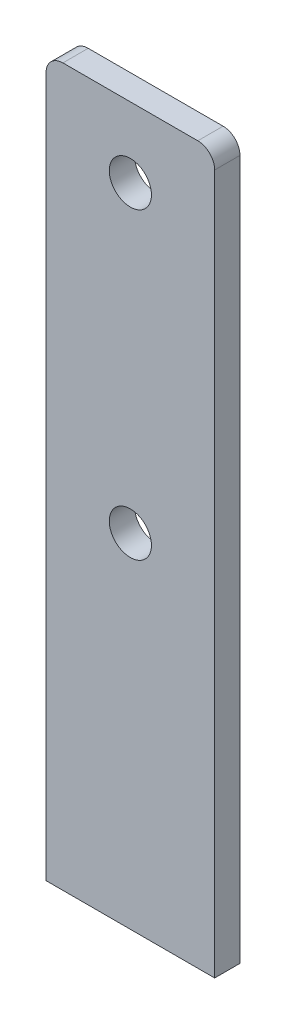
ISO-10303-21;
HEADER;
FILE_DESCRIPTION(('STEP AP214'),'2;1');
FILE_NAME('part.step','',(''),(''),'','','');
FILE_SCHEMA(('AUTOMOTIVE_DESIGN { 1 0 10303 214 1 1 1 1 }'));
ENDSEC;
DATA;
#1=APPLICATION_CONTEXT('core data for automotive mechanical design processes');
#2=APPLICATION_PROTOCOL_DEFINITION('international standard','automotive_design',2000,#1);
#3=PRODUCT_CONTEXT('',#1,'mechanical');
#4=PRODUCT('Part','Part','',(#3));
#5=PRODUCT_RELATED_PRODUCT_CATEGORY('part','',(#4));
#6=PRODUCT_DEFINITION_FORMATION('','',#4);
#7=PRODUCT_DEFINITION_CONTEXT('part definition',#1,'design');
#8=PRODUCT_DEFINITION('design','',#6,#7);
#9=PRODUCT_DEFINITION_SHAPE('','',#8);
#10=(LENGTH_UNIT() NAMED_UNIT(*) SI_UNIT(.MILLI.,.METRE.));
#11=(NAMED_UNIT(*) PLANE_ANGLE_UNIT() SI_UNIT($,.RADIAN.));
#12=(NAMED_UNIT(*) SI_UNIT($,.STERADIAN.) SOLID_ANGLE_UNIT());
#13=UNCERTAINTY_MEASURE_WITH_UNIT(LENGTH_MEASURE(1.E-05),#10,'distance_accuracy_value','');
#14=(GEOMETRIC_REPRESENTATION_CONTEXT(3) GLOBAL_UNCERTAINTY_ASSIGNED_CONTEXT((#13)) GLOBAL_UNIT_ASSIGNED_CONTEXT((#10,
#11,#12)) REPRESENTATION_CONTEXT('',''));
#15=CARTESIAN_POINT('',(0.,0.,0.));
#16=DIRECTION('',(0.,0.,1.));
#17=DIRECTION('',(1.,0.,0.));
#18=AXIS2_PLACEMENT_3D('',#15,#16,#17);
#19=CARTESIAN_POINT('',(0.,85.,3.));
#20=DIRECTION('',(0.,-1.,0.));
#21=DIRECTION('',(0.,0.,-1.));
#22=AXIS2_PLACEMENT_3D('',#19,#20,#21);
#23=PLANE('',#22);
#24=DIRECTION('',(-1.,0.,0.));
#25=VECTOR('',#24,1.);
#26=CARTESIAN_POINT('',(0.,85.,0.));
#27=LINE('',#26,#25);
#28=CARTESIAN_POINT('',(18.,85.,0.));
#29=VERTEX_POINT('',#28);
#30=CARTESIAN_POINT('',(2.,85.,0.));
#31=VERTEX_POINT('',#30);
#32=EDGE_CURVE('E141',#29,#31,#27,.T.);
#33=ORIENTED_EDGE('',*,*,#32,.T.);
#34=DIRECTION('',(0.,0.,-1.));
#35=VECTOR('',#34,1.);
#36=CARTESIAN_POINT('',(2.,85.,3.));
#37=LINE('',#36,#35);
#38=CARTESIAN_POINT('',(2.,85.,3.));
#39=VERTEX_POINT('',#38);
#40=EDGE_CURVE('E11',#39,#31,#37,.T.);
#41=ORIENTED_EDGE('',*,*,#40,.F.);
#42=DIRECTION('',(-1.,0.,0.));
#43=VECTOR('',#42,1.);
#44=CARTESIAN_POINT('',(0.,85.,3.));
#45=LINE('',#44,#43);
#46=CARTESIAN_POINT('',(18.,85.,3.));
#47=VERTEX_POINT('',#46);
#48=EDGE_CURVE('E275',#47,#39,#45,.T.);
#49=ORIENTED_EDGE('',*,*,#48,.F.);
#50=DIRECTION('',(0.,0.,-1.));
#51=VECTOR('',#50,1.);
#52=CARTESIAN_POINT('',(18.,85.,3.));
#53=LINE('',#52,#51);
#54=EDGE_CURVE('E59',#47,#29,#53,.T.);
#55=ORIENTED_EDGE('',*,*,#54,.T.);
#56=EDGE_LOOP('',(#33,#41,#49,#55));
#57=FACE_BOUND('',#56,.T.);
#58=ADVANCED_FACE('F41',(#57),#23,.F.);
#59=CARTESIAN_POINT('',(2.,83.,3.));
#60=DIRECTION('',(0.,0.,-1.));
#61=DIRECTION('',(-1.,0.,0.));
#62=AXIS2_PLACEMENT_3D('',#59,#60,#61);
#63=CYLINDRICAL_SURFACE('',#62,1.99999999999999);
#64=CARTESIAN_POINT('',(2.,83.,0.));
#65=DIRECTION('',(0.,0.,1.));
#66=DIRECTION('',(1.,0.,0.));
#67=AXIS2_PLACEMENT_3D('',#64,#65,#66);
#68=CIRCLE('',#67,1.99999999999999);
#69=CARTESIAN_POINT('',(0.,83.,0.));
#70=VERTEX_POINT('',#69);
#71=EDGE_CURVE('E144',#31,#70,#68,.T.);
#72=ORIENTED_EDGE('',*,*,#71,.T.);
#73=DIRECTION('',(0.,0.,-1.));
#74=VECTOR('',#73,1.);
#75=CARTESIAN_POINT('',(0.,83.,3.));
#76=LINE('',#75,#74);
#77=CARTESIAN_POINT('',(0.,83.,3.));
#78=VERTEX_POINT('',#77);
#79=EDGE_CURVE('E51',#78,#70,#76,.T.);
#80=ORIENTED_EDGE('',*,*,#79,.F.);
#81=CARTESIAN_POINT('',(2.,83.,3.));
#82=DIRECTION('',(0.,0.,1.));
#83=DIRECTION('',(1.,0.,0.));
#84=AXIS2_PLACEMENT_3D('',#81,#82,#83);
#85=CIRCLE('',#84,1.99999999999999);
#86=EDGE_CURVE('E92',#39,#78,#85,.T.);
#87=ORIENTED_EDGE('',*,*,#86,.F.);
#88=ORIENTED_EDGE('',*,*,#40,.T.);
#89=EDGE_LOOP('',(#72,#80,#87,#88));
#90=FACE_BOUND('',#89,.T.);
#91=ADVANCED_FACE('F171',(#90),#63,.T.);
#92=CARTESIAN_POINT('',(0.,0.,3.));
#93=DIRECTION('',(-1.,0.,0.));
#94=DIRECTION('',(0.,0.,1.));
#95=AXIS2_PLACEMENT_3D('',#92,#93,#94);
#96=PLANE('',#95);
#97=DIRECTION('',(0.,1.,0.));
#98=VECTOR('',#97,1.);
#99=CARTESIAN_POINT('',(0.,0.,0.));
#100=LINE('',#99,#98);
#101=CARTESIAN_POINT('',(0.,0.,0.));
#102=VERTEX_POINT('',#101);
#103=EDGE_CURVE('E148',#102,#70,#100,.T.);
#104=ORIENTED_EDGE('',*,*,#103,.F.);
#105=DIRECTION('',(0.,0.,-1.));
#106=VECTOR('',#105,1.);
#107=CARTESIAN_POINT('',(0.,0.,3.));
#108=LINE('',#107,#106);
#109=CARTESIAN_POINT('',(0.,0.,3.));
#110=VERTEX_POINT('',#109);
#111=EDGE_CURVE('E112',#110,#102,#108,.T.);
#112=ORIENTED_EDGE('',*,*,#111,.F.);
#113=DIRECTION('',(0.,1.,0.));
#114=VECTOR('',#113,1.);
#115=CARTESIAN_POINT('',(0.,0.,3.));
#116=LINE('',#115,#114);
#117=EDGE_CURVE('E124',#110,#78,#116,.T.);
#118=ORIENTED_EDGE('',*,*,#117,.T.);
#119=ORIENTED_EDGE('',*,*,#79,.T.);
#120=EDGE_LOOP('',(#104,#112,#118,#119));
#121=FACE_BOUND('',#120,.T.);
#122=ADVANCED_FACE('F170',(#121),#96,.T.);
#123=CARTESIAN_POINT('',(0.,0.,3.));
#124=DIRECTION('',(0.,-1.,0.));
#125=DIRECTION('',(0.,0.,-1.));
#126=AXIS2_PLACEMENT_3D('',#123,#124,#125);
#127=PLANE('',#126);
#128=DIRECTION('',(-1.,0.,0.));
#129=VECTOR('',#128,1.);
#130=CARTESIAN_POINT('',(0.,0.,0.));
#131=LINE('',#130,#129);
#132=CARTESIAN_POINT('',(20.,0.,0.));
#133=VERTEX_POINT('',#132);
#134=EDGE_CURVE('E108',#133,#102,#131,.T.);
#135=ORIENTED_EDGE('',*,*,#134,.F.);
#136=DIRECTION('',(0.,0.,-1.));
#137=VECTOR('',#136,1.);
#138=CARTESIAN_POINT('',(20.,0.,3.));
#139=LINE('',#138,#137);
#140=CARTESIAN_POINT('',(20.,0.,3.));
#141=VERTEX_POINT('',#140);
#142=EDGE_CURVE('E102',#141,#133,#139,.T.);
#143=ORIENTED_EDGE('',*,*,#142,.F.);
#144=DIRECTION('',(-1.,0.,0.));
#145=VECTOR('',#144,1.);
#146=CARTESIAN_POINT('',(0.,0.,3.));
#147=LINE('',#146,#145);
#148=EDGE_CURVE('E106',#141,#110,#147,.T.);
#149=ORIENTED_EDGE('',*,*,#148,.T.);
#150=ORIENTED_EDGE('',*,*,#111,.T.);
#151=EDGE_LOOP('',(#135,#143,#149,#150));
#152=FACE_BOUND('',#151,.T.);
#153=ADVANCED_FACE('F104',(#152),#127,.T.);
#154=CARTESIAN_POINT('',(20.,0.,3.));
#155=DIRECTION('',(-1.,0.,0.));
#156=DIRECTION('',(0.,0.,1.));
#157=AXIS2_PLACEMENT_3D('',#154,#155,#156);
#158=PLANE('',#157);
#159=DIRECTION('',(0.,1.,0.));
#160=VECTOR('',#159,1.);
#161=CARTESIAN_POINT('',(20.,0.,0.));
#162=LINE('',#161,#160);
#163=CARTESIAN_POINT('',(20.,83.,0.));
#164=VERTEX_POINT('',#163);
#165=EDGE_CURVE('E154',#133,#164,#162,.T.);
#166=ORIENTED_EDGE('',*,*,#165,.T.);
#167=DIRECTION('',(0.,0.,-1.));
#168=VECTOR('',#167,1.);
#169=CARTESIAN_POINT('',(20.,83.,3.));
#170=LINE('',#169,#168);
#171=CARTESIAN_POINT('',(20.,83.,3.));
#172=VERTEX_POINT('',#171);
#173=EDGE_CURVE('E80',#172,#164,#170,.T.);
#174=ORIENTED_EDGE('',*,*,#173,.F.);
#175=DIRECTION('',(0.,1.,0.));
#176=VECTOR('',#175,1.);
#177=CARTESIAN_POINT('',(20.,0.,3.));
#178=LINE('',#177,#176);
#179=EDGE_CURVE('E114',#141,#172,#178,.T.);
#180=ORIENTED_EDGE('',*,*,#179,.F.);
#181=ORIENTED_EDGE('',*,*,#142,.T.);
#182=EDGE_LOOP('',(#166,#174,#180,#181));
#183=FACE_BOUND('',#182,.T.);
#184=ADVANCED_FACE('F115',(#183),#158,.F.);
#185=CARTESIAN_POINT('',(9.99999999999963,76.69,3.));
#186=DIRECTION('',(0.,0.,-1.));
#187=DIRECTION('',(-1.,0.,0.));
#188=AXIS2_PLACEMENT_3D('',#185,#186,#187);
#189=CYLINDRICAL_SURFACE('',#188,2.5);
#190=CARTESIAN_POINT('',(9.99999999999963,76.69,3.));
#191=DIRECTION('',(0.,0.,1.));
#192=DIRECTION('',(1.,0.,0.));
#193=AXIS2_PLACEMENT_3D('',#190,#191,#192);
#194=CIRCLE('',#193,2.5);
#195=CARTESIAN_POINT('',(12.4999999999996,76.69,3.));
#196=VERTEX_POINT('',#195);
#197=EDGE_CURVE('E203',#196,#196,#194,.T.);
#198=ORIENTED_EDGE('',*,*,#197,.T.);
#199=EDGE_LOOP('',(#198));
#200=FACE_BOUND('',#199,.T.);
#201=CARTESIAN_POINT('',(9.99999999999963,76.69,0.));
#202=DIRECTION('',(0.,0.,1.));
#203=DIRECTION('',(1.,0.,0.));
#204=AXIS2_PLACEMENT_3D('',#201,#202,#203);
#205=CIRCLE('',#204,2.5);
#206=CARTESIAN_POINT('',(12.4999999999996,76.69,0.));
#207=VERTEX_POINT('',#206);
#208=EDGE_CURVE('E137',#207,#207,#205,.T.);
#209=ORIENTED_EDGE('',*,*,#208,.F.);
#210=EDGE_LOOP('',(#209));
#211=FACE_BOUND('',#210,.T.);
#212=ADVANCED_FACE('F184',(#200,#211),#189,.F.);
#213=CARTESIAN_POINT('',(10.,40.69,3.));
#214=DIRECTION('',(0.,0.,-1.));
#215=DIRECTION('',(-1.,0.,0.));
#216=AXIS2_PLACEMENT_3D('',#213,#214,#215);
#217=CYLINDRICAL_SURFACE('',#216,2.5);
#218=CARTESIAN_POINT('',(10.,40.69,3.));
#219=DIRECTION('',(0.,0.,1.));
#220=DIRECTION('',(1.,0.,0.));
#221=AXIS2_PLACEMENT_3D('',#218,#219,#220);
#222=CIRCLE('',#221,2.5);
#223=CARTESIAN_POINT('',(12.5,40.69,3.));
#224=VERTEX_POINT('',#223);
#225=EDGE_CURVE('E161',#224,#224,#222,.T.);
#226=ORIENTED_EDGE('',*,*,#225,.T.);
#227=EDGE_LOOP('',(#226));
#228=FACE_BOUND('',#227,.T.);
#229=CARTESIAN_POINT('',(10.,40.69,0.));
#230=DIRECTION('',(0.,0.,1.));
#231=DIRECTION('',(1.,0.,0.));
#232=AXIS2_PLACEMENT_3D('',#229,#230,#231);
#233=CIRCLE('',#232,2.5);
#234=CARTESIAN_POINT('',(12.5,40.69,0.));
#235=VERTEX_POINT('',#234);
#236=EDGE_CURVE('E133',#235,#235,#233,.T.);
#237=ORIENTED_EDGE('',*,*,#236,.F.);
#238=EDGE_LOOP('',(#237));
#239=FACE_BOUND('',#238,.T.);
#240=ADVANCED_FACE('F43',(#228,#239),#217,.F.);
#241=CARTESIAN_POINT('',(18.,83.,3.));
#242=DIRECTION('',(0.,0.,-1.));
#243=DIRECTION('',(-1.,0.,0.));
#244=AXIS2_PLACEMENT_3D('',#241,#242,#243);
#245=CYLINDRICAL_SURFACE('',#244,1.99999999999999);
#246=CARTESIAN_POINT('',(18.,83.,0.));
#247=DIRECTION('',(0.,0.,1.));
#248=DIRECTION('',(1.,0.,0.));
#249=AXIS2_PLACEMENT_3D('',#246,#247,#248);
#250=CIRCLE('',#249,1.99999999999999);
#251=EDGE_CURVE('E157',#29,#164,#250,.F.);
#252=ORIENTED_EDGE('',*,*,#251,.F.);
#253=ORIENTED_EDGE('',*,*,#54,.F.);
#254=CARTESIAN_POINT('',(18.,83.,3.));
#255=DIRECTION('',(0.,0.,1.));
#256=DIRECTION('',(1.,0.,0.));
#257=AXIS2_PLACEMENT_3D('',#254,#255,#256);
#258=CIRCLE('',#257,1.99999999999999);
#259=EDGE_CURVE('E119',#47,#172,#258,.F.);
#260=ORIENTED_EDGE('',*,*,#259,.T.);
#261=ORIENTED_EDGE('',*,*,#173,.T.);
#262=EDGE_LOOP('',(#252,#253,#260,#261));
#263=FACE_BOUND('',#262,.T.);
#264=ADVANCED_FACE('F175',(#263),#245,.T.);
#265=CARTESIAN_POINT('',(0.,0.,3.));
#266=DIRECTION('',(0.,0.,1.));
#267=DIRECTION('',(1.,0.,0.));
#268=AXIS2_PLACEMENT_3D('',#265,#266,#267);
#269=PLANE('',#268);
#270=ORIENTED_EDGE('',*,*,#225,.F.);
#271=EDGE_LOOP('',(#270));
#272=FACE_BOUND('',#271,.T.);
#273=ORIENTED_EDGE('',*,*,#197,.F.);
#274=EDGE_LOOP('',(#273));
#275=FACE_BOUND('',#274,.T.);
#276=ORIENTED_EDGE('',*,*,#48,.T.);
#277=ORIENTED_EDGE('',*,*,#86,.T.);
#278=ORIENTED_EDGE('',*,*,#117,.F.);
#279=ORIENTED_EDGE('',*,*,#148,.F.);
#280=ORIENTED_EDGE('',*,*,#179,.T.);
#281=ORIENTED_EDGE('',*,*,#259,.F.);
#282=EDGE_LOOP('',(#276,#277,#278,#279,#280,#281));
#283=FACE_BOUND('',#282,.T.);
#284=ADVANCED_FACE('F122',(#272,#275,#283),#269,.T.);
#285=CARTESIAN_POINT('',(0.,0.,0.));
#286=DIRECTION('',(0.,0.,1.));
#287=DIRECTION('',(1.,0.,0.));
#288=AXIS2_PLACEMENT_3D('',#285,#286,#287);
#289=PLANE('',#288);
#290=ORIENTED_EDGE('',*,*,#236,.T.);
#291=EDGE_LOOP('',(#290));
#292=FACE_BOUND('',#291,.T.);
#293=ORIENTED_EDGE('',*,*,#208,.T.);
#294=EDGE_LOOP('',(#293));
#295=FACE_BOUND('',#294,.T.);
#296=ORIENTED_EDGE('',*,*,#32,.F.);
#297=ORIENTED_EDGE('',*,*,#251,.T.);
#298=ORIENTED_EDGE('',*,*,#165,.F.);
#299=ORIENTED_EDGE('',*,*,#134,.T.);
#300=ORIENTED_EDGE('',*,*,#103,.T.);
#301=ORIENTED_EDGE('',*,*,#71,.F.);
#302=EDGE_LOOP('',(#296,#297,#298,#299,#300,#301));
#303=FACE_BOUND('',#302,.T.);
#304=ADVANCED_FACE('F174',(#292,#295,#303),#289,.F.);
#305=CLOSED_SHELL('',(#58,#91,#122,#153,#184,#212,#240,#264,#284,#304));
#306=MANIFOLD_SOLID_BREP('B2',#305);
#307=ADVANCED_BREP_SHAPE_REPRESENTATION('',(#18,#306),#14);
#308=SHAPE_DEFINITION_REPRESENTATION(#9,#307);
ENDSEC;
END-ISO-10303-21;
